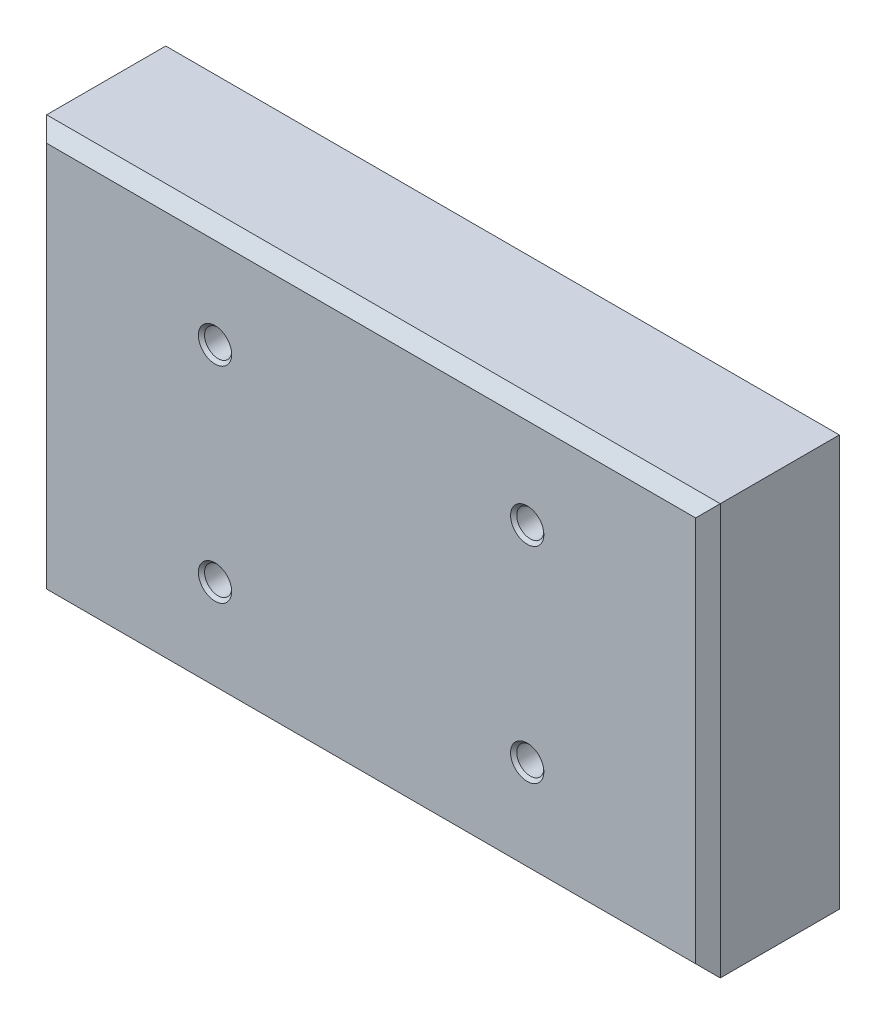
ISO-10303-21;
HEADER;
FILE_DESCRIPTION(('STEP AP214'),'2;1');
FILE_NAME('part.step','',(''),(''),'','','');
FILE_SCHEMA(('AUTOMOTIVE_DESIGN { 1 0 10303 214 1 1 1 1 }'));
ENDSEC;
DATA;
#1=APPLICATION_CONTEXT('core data for automotive mechanical design processes');
#2=APPLICATION_PROTOCOL_DEFINITION('international standard','automotive_design',2000,#1);
#3=PRODUCT_CONTEXT('',#1,'mechanical');
#4=PRODUCT('Part','Part','',(#3));
#5=PRODUCT_RELATED_PRODUCT_CATEGORY('part','',(#4));
#6=PRODUCT_DEFINITION_FORMATION('','',#4);
#7=PRODUCT_DEFINITION_CONTEXT('part definition',#1,'design');
#8=PRODUCT_DEFINITION('design','',#6,#7);
#9=PRODUCT_DEFINITION_SHAPE('','',#8);
#10=(LENGTH_UNIT() NAMED_UNIT(*) SI_UNIT(.MILLI.,.METRE.));
#11=(NAMED_UNIT(*) PLANE_ANGLE_UNIT() SI_UNIT($,.RADIAN.));
#12=(NAMED_UNIT(*) SI_UNIT($,.STERADIAN.) SOLID_ANGLE_UNIT());
#13=UNCERTAINTY_MEASURE_WITH_UNIT(LENGTH_MEASURE(1.E-05),#10,'distance_accuracy_value','');
#14=(GEOMETRIC_REPRESENTATION_CONTEXT(3) GLOBAL_UNCERTAINTY_ASSIGNED_CONTEXT((#13)) GLOBAL_UNIT_ASSIGNED_CONTEXT((#10,
#11,#12)) REPRESENTATION_CONTEXT('',''));
#15=CARTESIAN_POINT('',(0.,0.,0.));
#16=DIRECTION('',(0.,0.,1.));
#17=DIRECTION('',(1.,0.,0.));
#18=AXIS2_PLACEMENT_3D('',#15,#16,#17);
#19=CARTESIAN_POINT('',(20.5,-12.5,20.0254530007024));
#20=DIRECTION('',(-1.,0.,0.));
#21=DIRECTION('',(0.,-1.,0.));
#22=AXIS2_PLACEMENT_3D('',#19,#20,#21);
#23=PLANE('',#22);
#24=DIRECTION('',(0.,0.,-1.));
#25=VECTOR('',#24,1.);
#26=CARTESIAN_POINT('',(20.5,62.5,20.0254530007024));
#27=LINE('',#26,#25);
#28=CARTESIAN_POINT('',(20.5,62.5,17.7754530007024));
#29=VERTEX_POINT('',#28);
#30=CARTESIAN_POINT('',(20.5,62.5,-3.97454699929757));
#31=VERTEX_POINT('',#30);
#32=EDGE_CURVE('E169',#29,#31,#27,.T.);
#33=ORIENTED_EDGE('',*,*,#32,.F.);
#34=DIRECTION('',(0.,-1.,0.));
#35=VECTOR('',#34,1.);
#36=CARTESIAN_POINT('',(20.5,-12.5,17.7754530007024));
#37=LINE('',#36,#35);
#38=CARTESIAN_POINT('',(20.5,-12.5,17.7754530007024));
#39=VERTEX_POINT('',#38);
#40=EDGE_CURVE('E67',#29,#39,#37,.T.);
#41=ORIENTED_EDGE('',*,*,#40,.T.);
#42=DIRECTION('',(0.,0.,-1.));
#43=VECTOR('',#42,1.);
#44=CARTESIAN_POINT('',(20.5,-12.5,20.0254530007024));
#45=LINE('',#44,#43);
#46=CARTESIAN_POINT('',(20.5,-12.5,-3.97454699929757));
#47=VERTEX_POINT('',#46);
#48=EDGE_CURVE('E163',#39,#47,#45,.T.);
#49=ORIENTED_EDGE('',*,*,#48,.T.);
#50=DIRECTION('',(0.,1.,0.));
#51=VECTOR('',#50,1.);
#52=CARTESIAN_POINT('',(20.5,-12.5,-3.97454699929757));
#53=LINE('',#52,#51);
#54=EDGE_CURVE('E151',#47,#31,#53,.T.);
#55=ORIENTED_EDGE('',*,*,#54,.T.);
#56=EDGE_LOOP('',(#33,#41,#49,#55));
#57=FACE_BOUND('',#56,.T.);
#58=ADVANCED_FACE('F43',(#57),#23,.F.);
#59=CARTESIAN_POINT('',(20.5,62.5,20.0254530007024));
#60=DIRECTION('',(0.,-1.,0.));
#61=DIRECTION('',(1.,0.,0.));
#62=AXIS2_PLACEMENT_3D('',#59,#60,#61);
#63=PLANE('',#62);
#64=DIRECTION('',(0.,0.,-1.));
#65=VECTOR('',#64,1.);
#66=CARTESIAN_POINT('',(-102.5,62.5,20.0254530007024));
#67=LINE('',#66,#65);
#68=CARTESIAN_POINT('',(-102.5,62.5,17.7754530007024));
#69=VERTEX_POINT('',#68);
#70=CARTESIAN_POINT('',(-102.5,62.5,-3.97454699929757));
#71=VERTEX_POINT('',#70);
#72=EDGE_CURVE('E167',#69,#71,#67,.T.);
#73=ORIENTED_EDGE('',*,*,#72,.F.);
#74=DIRECTION('',(1.,0.,0.));
#75=VECTOR('',#74,1.);
#76=CARTESIAN_POINT('',(20.5,62.5,17.7754530007024));
#77=LINE('',#76,#75);
#78=EDGE_CURVE('E180',#69,#29,#77,.T.);
#79=ORIENTED_EDGE('',*,*,#78,.T.);
#80=ORIENTED_EDGE('',*,*,#32,.T.);
#81=DIRECTION('',(-1.,0.,0.));
#82=VECTOR('',#81,1.);
#83=CARTESIAN_POINT('',(20.5,62.5,-3.97454699929757));
#84=LINE('',#83,#82);
#85=EDGE_CURVE('E154',#31,#71,#84,.T.);
#86=ORIENTED_EDGE('',*,*,#85,.T.);
#87=EDGE_LOOP('',(#73,#79,#80,#86));
#88=FACE_BOUND('',#87,.T.);
#89=ADVANCED_FACE('F234',(#88),#63,.F.);
#90=CARTESIAN_POINT('',(-102.5,-12.5,20.0254530007024));
#91=DIRECTION('',(1.,0.,0.));
#92=DIRECTION('',(0.,0.,-1.));
#93=AXIS2_PLACEMENT_3D('',#90,#91,#92);
#94=PLANE('',#93);
#95=DIRECTION('',(0.,0.,-1.));
#96=VECTOR('',#95,1.);
#97=CARTESIAN_POINT('',(-102.5,-12.5,20.0254530007024));
#98=LINE('',#97,#96);
#99=CARTESIAN_POINT('',(-102.5,-12.5,17.7754530007024));
#100=VERTEX_POINT('',#99);
#101=CARTESIAN_POINT('',(-102.5,-12.5,-3.97454699929757));
#102=VERTEX_POINT('',#101);
#103=EDGE_CURVE('E165',#100,#102,#98,.T.);
#104=ORIENTED_EDGE('',*,*,#103,.F.);
#105=DIRECTION('',(0.,1.,0.));
#106=VECTOR('',#105,1.);
#107=CARTESIAN_POINT('',(-102.5,62.5,17.7754530007024));
#108=LINE('',#107,#106);
#109=EDGE_CURVE('E11',#100,#69,#108,.T.);
#110=ORIENTED_EDGE('',*,*,#109,.T.);
#111=ORIENTED_EDGE('',*,*,#72,.T.);
#112=DIRECTION('',(0.,-1.,0.));
#113=VECTOR('',#112,1.);
#114=CARTESIAN_POINT('',(-102.5,-12.5,-3.97454699929757));
#115=LINE('',#114,#113);
#116=EDGE_CURVE('E157',#71,#102,#115,.T.);
#117=ORIENTED_EDGE('',*,*,#116,.T.);
#118=EDGE_LOOP('',(#104,#110,#111,#117));
#119=FACE_BOUND('',#118,.T.);
#120=ADVANCED_FACE('F239',(#119),#94,.F.);
#121=CARTESIAN_POINT('',(20.5,-12.5,20.0254530007024));
#122=DIRECTION('',(0.,1.,0.));
#123=DIRECTION('',(-1.,0.,0.));
#124=AXIS2_PLACEMENT_3D('',#121,#122,#123);
#125=PLANE('',#124);
#126=ORIENTED_EDGE('',*,*,#48,.F.);
#127=DIRECTION('',(-1.,0.,0.));
#128=VECTOR('',#127,1.);
#129=CARTESIAN_POINT('',(-102.5,-12.5,17.7754530007024));
#130=LINE('',#129,#128);
#131=EDGE_CURVE('E52',#39,#100,#130,.T.);
#132=ORIENTED_EDGE('',*,*,#131,.T.);
#133=ORIENTED_EDGE('',*,*,#103,.T.);
#134=DIRECTION('',(1.,0.,0.));
#135=VECTOR('',#134,1.);
#136=CARTESIAN_POINT('',(20.5,-12.5,-3.97454699929757));
#137=LINE('',#136,#135);
#138=EDGE_CURVE('E160',#102,#47,#137,.T.);
#139=ORIENTED_EDGE('',*,*,#138,.T.);
#140=EDGE_LOOP('',(#126,#132,#133,#139));
#141=FACE_BOUND('',#140,.T.);
#142=ADVANCED_FACE('F207',(#141),#125,.F.);
#143=CARTESIAN_POINT('',(20.5,-12.5,20.0254530007024));
#144=DIRECTION('',(0.,0.,1.));
#145=DIRECTION('',(1.,0.,0.));
#146=AXIS2_PLACEMENT_3D('',#143,#144,#145);
#147=PLANE('',#146);
#148=DIRECTION('',(0.,1.,0.));
#149=VECTOR('',#148,1.);
#150=CARTESIAN_POINT('',(18.25,62.5,20.0254530007024));
#151=LINE('',#150,#149);
#152=CARTESIAN_POINT('',(18.25,-10.25,20.0254530007024));
#153=VERTEX_POINT('',#152);
#154=CARTESIAN_POINT('',(18.25,60.25,20.0254530007024));
#155=VERTEX_POINT('',#154);
#156=EDGE_CURVE('E175',#153,#155,#151,.T.);
#157=ORIENTED_EDGE('',*,*,#156,.T.);
#158=DIRECTION('',(-1.,0.,0.));
#159=VECTOR('',#158,1.);
#160=CARTESIAN_POINT('',(-102.5,60.25,20.0254530007024));
#161=LINE('',#160,#159);
#162=CARTESIAN_POINT('',(-100.25,60.25,20.0254530007024));
#163=VERTEX_POINT('',#162);
#164=EDGE_CURVE('E177',#155,#163,#161,.T.);
#165=ORIENTED_EDGE('',*,*,#164,.T.);
#166=DIRECTION('',(0.,-1.,0.));
#167=VECTOR('',#166,1.);
#168=CARTESIAN_POINT('',(-100.25,-12.5,20.0254530007024));
#169=LINE('',#168,#167);
#170=CARTESIAN_POINT('',(-100.25,-10.25,20.0254530007024));
#171=VERTEX_POINT('',#170);
#172=EDGE_CURVE('E171',#163,#171,#169,.T.);
#173=ORIENTED_EDGE('',*,*,#172,.T.);
#174=DIRECTION('',(1.,0.,0.));
#175=VECTOR('',#174,1.);
#176=CARTESIAN_POINT('',(20.5,-10.25,20.0254530007024));
#177=LINE('',#176,#175);
#178=EDGE_CURVE('E173',#171,#153,#177,.T.);
#179=ORIENTED_EDGE('',*,*,#178,.T.);
#180=EDGE_LOOP('',(#157,#165,#173,#179));
#181=FACE_BOUND('',#180,.T.);
#182=CARTESIAN_POINT('',(-69.5,43.75,20.0254530007024));
#183=DIRECTION('',(0.,0.,1.));
#184=DIRECTION('',(1.,0.,0.));
#185=AXIS2_PLACEMENT_3D('',#182,#183,#184);
#186=CIRCLE('',#185,3.0375);
#187=CARTESIAN_POINT('',(-66.4625,43.75,20.0254530007024));
#188=VERTEX_POINT('',#187);
#189=EDGE_CURVE('E124',#188,#188,#186,.T.);
#190=ORIENTED_EDGE('',*,*,#189,.F.);
#191=EDGE_LOOP('',(#190));
#192=FACE_BOUND('',#191,.T.);
#193=CARTESIAN_POINT('',(-69.5,6.25,20.0254530007024));
#194=DIRECTION('',(0.,0.,1.));
#195=DIRECTION('',(1.,0.,0.));
#196=AXIS2_PLACEMENT_3D('',#193,#194,#195);
#197=CIRCLE('',#196,3.0375);
#198=CARTESIAN_POINT('',(-66.4625,6.25,20.0254530007024));
#199=VERTEX_POINT('',#198);
#200=EDGE_CURVE('E117',#199,#199,#197,.T.);
#201=ORIENTED_EDGE('',*,*,#200,.F.);
#202=EDGE_LOOP('',(#201));
#203=FACE_BOUND('',#202,.T.);
#204=CARTESIAN_POINT('',(-12.5,6.25000000000001,20.0254530007024));
#205=DIRECTION('',(0.,0.,1.));
#206=DIRECTION('',(1.,0.,0.));
#207=AXIS2_PLACEMENT_3D('',#204,#205,#206);
#208=CIRCLE('',#207,3.0375);
#209=CARTESIAN_POINT('',(-9.46249999999999,6.25000000000001,20.0254530007024));
#210=VERTEX_POINT('',#209);
#211=EDGE_CURVE('E133',#210,#210,#208,.T.);
#212=ORIENTED_EDGE('',*,*,#211,.F.);
#213=EDGE_LOOP('',(#212));
#214=FACE_BOUND('',#213,.T.);
#215=CARTESIAN_POINT('',(-12.5,43.75,20.0254530007024));
#216=DIRECTION('',(0.,0.,1.));
#217=DIRECTION('',(1.,0.,0.));
#218=AXIS2_PLACEMENT_3D('',#215,#216,#217);
#219=CIRCLE('',#218,3.0375);
#220=CARTESIAN_POINT('',(-9.4625,43.75,20.0254530007024));
#221=VERTEX_POINT('',#220);
#222=EDGE_CURVE('E142',#221,#221,#219,.T.);
#223=ORIENTED_EDGE('',*,*,#222,.F.);
#224=EDGE_LOOP('',(#223));
#225=FACE_BOUND('',#224,.T.);
#226=ADVANCED_FACE('F203',(#181,#192,#203,#214,#225),#147,.T.);
#227=CARTESIAN_POINT('',(20.5,-12.5,-3.97454699929757));
#228=DIRECTION('',(0.,0.,1.));
#229=DIRECTION('',(1.,0.,0.));
#230=AXIS2_PLACEMENT_3D('',#227,#228,#229);
#231=PLANE('',#230);
#232=ORIENTED_EDGE('',*,*,#54,.F.);
#233=ORIENTED_EDGE('',*,*,#138,.F.);
#234=ORIENTED_EDGE('',*,*,#116,.F.);
#235=ORIENTED_EDGE('',*,*,#85,.F.);
#236=EDGE_LOOP('',(#232,#233,#234,#235));
#237=FACE_BOUND('',#236,.T.);
#238=ADVANCED_FACE('F206',(#237),#231,.F.);
#239=CARTESIAN_POINT('',(-12.5,43.75,8.02545300070243));
#240=DIRECTION('',(0.,0.,1.));
#241=DIRECTION('',(1.,0.,0.));
#242=AXIS2_PLACEMENT_3D('',#239,#240,#241);
#243=CONICAL_SURFACE('',#242,2.475,1.02974425867665);
#244=CARTESIAN_POINT('',(-12.5,43.75,6.53832296860922));
#245=VERTEX_POINT('',#244);
#246=VERTEX_LOOP('',#245);
#247=FACE_BOUND('',#246,.T.);
#248=CARTESIAN_POINT('',(-12.5,43.75,8.02545300070243));
#249=DIRECTION('',(0.,0.,1.));
#250=DIRECTION('',(1.,0.,0.));
#251=AXIS2_PLACEMENT_3D('',#248,#249,#250);
#252=CIRCLE('',#251,2.475);
#253=CARTESIAN_POINT('',(-10.025,43.75,8.02545300070243));
#254=VERTEX_POINT('',#253);
#255=EDGE_CURVE('E148',#254,#254,#252,.T.);
#256=ORIENTED_EDGE('',*,*,#255,.T.);
#257=EDGE_LOOP('',(#256));
#258=FACE_BOUND('',#257,.T.);
#259=ADVANCED_FACE('F229',(#247,#258),#243,.F.);
#260=CARTESIAN_POINT('',(-12.5,43.75,20.0254530007024));
#261=DIRECTION('',(0.,0.,1.));
#262=DIRECTION('',(1.,0.,0.));
#263=AXIS2_PLACEMENT_3D('',#260,#261,#262);
#264=CYLINDRICAL_SURFACE('',#263,2.475);
#265=ORIENTED_EDGE('',*,*,#255,.F.);
#266=EDGE_LOOP('',(#265));
#267=FACE_BOUND('',#266,.T.);
#268=CARTESIAN_POINT('',(-12.5,43.75,19.4629530007024));
#269=DIRECTION('',(0.,0.,1.));
#270=DIRECTION('',(1.,0.,0.));
#271=AXIS2_PLACEMENT_3D('',#268,#269,#270);
#272=CIRCLE('',#271,2.475);
#273=CARTESIAN_POINT('',(-10.025,43.75,19.4629530007024));
#274=VERTEX_POINT('',#273);
#275=EDGE_CURVE('E145',#274,#274,#272,.T.);
#276=ORIENTED_EDGE('',*,*,#275,.T.);
#277=EDGE_LOOP('',(#276));
#278=FACE_BOUND('',#277,.T.);
#279=ADVANCED_FACE('F219',(#267,#278),#264,.F.);
#280=CARTESIAN_POINT('',(-12.5,43.75,20.0254530007024));
#281=DIRECTION('',(0.,0.,1.));
#282=DIRECTION('',(1.,0.,0.));
#283=AXIS2_PLACEMENT_3D('',#280,#281,#282);
#284=CONICAL_SURFACE('',#283,3.0375,0.785398163397444);
#285=ORIENTED_EDGE('',*,*,#275,.F.);
#286=EDGE_LOOP('',(#285));
#287=FACE_BOUND('',#286,.T.);
#288=ORIENTED_EDGE('',*,*,#222,.T.);
#289=EDGE_LOOP('',(#288));
#290=FACE_BOUND('',#289,.T.);
#291=ADVANCED_FACE('F216',(#287,#290),#284,.F.);
#292=CARTESIAN_POINT('',(-12.5,6.25000000000001,8.02545300070243));
#293=DIRECTION('',(0.,0.,1.));
#294=DIRECTION('',(1.,0.,0.));
#295=AXIS2_PLACEMENT_3D('',#292,#293,#294);
#296=CONICAL_SURFACE('',#295,2.475,1.02974425867665);
#297=CARTESIAN_POINT('',(-12.5,6.25000000000001,6.53832296860922));
#298=VERTEX_POINT('',#297);
#299=VERTEX_LOOP('',#298);
#300=FACE_BOUND('',#299,.T.);
#301=CARTESIAN_POINT('',(-12.5,6.25000000000001,8.02545300070243));
#302=DIRECTION('',(0.,0.,1.));
#303=DIRECTION('',(1.,0.,0.));
#304=AXIS2_PLACEMENT_3D('',#301,#302,#303);
#305=CIRCLE('',#304,2.475);
#306=CARTESIAN_POINT('',(-10.025,6.25000000000001,8.02545300070243));
#307=VERTEX_POINT('',#306);
#308=EDGE_CURVE('E139',#307,#307,#305,.T.);
#309=ORIENTED_EDGE('',*,*,#308,.T.);
#310=EDGE_LOOP('',(#309));
#311=FACE_BOUND('',#310,.T.);
#312=ADVANCED_FACE('F218',(#300,#311),#296,.F.);
#313=CARTESIAN_POINT('',(-12.5,6.25000000000001,20.0254530007024));
#314=DIRECTION('',(0.,0.,1.));
#315=DIRECTION('',(1.,0.,0.));
#316=AXIS2_PLACEMENT_3D('',#313,#314,#315);
#317=CYLINDRICAL_SURFACE('',#316,2.475);
#318=ORIENTED_EDGE('',*,*,#308,.F.);
#319=EDGE_LOOP('',(#318));
#320=FACE_BOUND('',#319,.T.);
#321=CARTESIAN_POINT('',(-12.5,6.25000000000001,19.4629530007024));
#322=DIRECTION('',(0.,0.,1.));
#323=DIRECTION('',(1.,0.,0.));
#324=AXIS2_PLACEMENT_3D('',#321,#322,#323);
#325=CIRCLE('',#324,2.475);
#326=CARTESIAN_POINT('',(-10.025,6.25000000000001,19.4629530007024));
#327=VERTEX_POINT('',#326);
#328=EDGE_CURVE('E136',#327,#327,#325,.T.);
#329=ORIENTED_EDGE('',*,*,#328,.T.);
#330=EDGE_LOOP('',(#329));
#331=FACE_BOUND('',#330,.T.);
#332=ADVANCED_FACE('F226',(#320,#331),#317,.F.);
#333=CARTESIAN_POINT('',(-12.5,6.25000000000001,20.0254530007024));
#334=DIRECTION('',(0.,0.,1.));
#335=DIRECTION('',(1.,0.,0.));
#336=AXIS2_PLACEMENT_3D('',#333,#334,#335);
#337=CONICAL_SURFACE('',#336,3.0375,0.785398163397444);
#338=ORIENTED_EDGE('',*,*,#328,.F.);
#339=EDGE_LOOP('',(#338));
#340=FACE_BOUND('',#339,.T.);
#341=ORIENTED_EDGE('',*,*,#211,.T.);
#342=EDGE_LOOP('',(#341));
#343=FACE_BOUND('',#342,.T.);
#344=ADVANCED_FACE('F303',(#340,#343),#337,.F.);
#345=CARTESIAN_POINT('',(-69.5,6.25,8.02545300070243));
#346=DIRECTION('',(0.,0.,1.));
#347=DIRECTION('',(1.,0.,0.));
#348=AXIS2_PLACEMENT_3D('',#345,#346,#347);
#349=CONICAL_SURFACE('',#348,2.475,1.02974425867665);
#350=CARTESIAN_POINT('',(-69.5,6.25,6.53832296860922));
#351=VERTEX_POINT('',#350);
#352=VERTEX_LOOP('',#351);
#353=FACE_BOUND('',#352,.T.);
#354=CARTESIAN_POINT('',(-69.5,6.25,8.02545300070243));
#355=DIRECTION('',(0.,0.,1.));
#356=DIRECTION('',(1.,0.,0.));
#357=AXIS2_PLACEMENT_3D('',#354,#355,#356);
#358=CIRCLE('',#357,2.475);
#359=CARTESIAN_POINT('',(-67.025,6.25,8.02545300070243));
#360=VERTEX_POINT('',#359);
#361=EDGE_CURVE('E130',#360,#360,#358,.T.);
#362=ORIENTED_EDGE('',*,*,#361,.T.);
#363=EDGE_LOOP('',(#362));
#364=FACE_BOUND('',#363,.T.);
#365=ADVANCED_FACE('F317',(#353,#364),#349,.F.);
#366=CARTESIAN_POINT('',(-69.5,6.25,20.0254530007024));
#367=DIRECTION('',(0.,0.,1.));
#368=DIRECTION('',(1.,0.,0.));
#369=AXIS2_PLACEMENT_3D('',#366,#367,#368);
#370=CYLINDRICAL_SURFACE('',#369,2.475);
#371=ORIENTED_EDGE('',*,*,#361,.F.);
#372=EDGE_LOOP('',(#371));
#373=FACE_BOUND('',#372,.T.);
#374=CARTESIAN_POINT('',(-69.5,6.25,19.4629530007024));
#375=DIRECTION('',(0.,0.,1.));
#376=DIRECTION('',(1.,0.,0.));
#377=AXIS2_PLACEMENT_3D('',#374,#375,#376);
#378=CIRCLE('',#377,2.475);
#379=CARTESIAN_POINT('',(-67.025,6.25,19.4629530007024));
#380=VERTEX_POINT('',#379);
#381=EDGE_CURVE('E121',#380,#380,#378,.T.);
#382=ORIENTED_EDGE('',*,*,#381,.T.);
#383=EDGE_LOOP('',(#382));
#384=FACE_BOUND('',#383,.T.);
#385=ADVANCED_FACE('F312',(#373,#384),#370,.F.);
#386=CARTESIAN_POINT('',(-69.5,6.25,20.0254530007024));
#387=DIRECTION('',(0.,0.,1.));
#388=DIRECTION('',(1.,0.,0.));
#389=AXIS2_PLACEMENT_3D('',#386,#387,#388);
#390=CONICAL_SURFACE('',#389,3.0375,0.785398163397444);
#391=ORIENTED_EDGE('',*,*,#381,.F.);
#392=EDGE_LOOP('',(#391));
#393=FACE_BOUND('',#392,.T.);
#394=ORIENTED_EDGE('',*,*,#200,.T.);
#395=EDGE_LOOP('',(#394));
#396=FACE_BOUND('',#395,.T.);
#397=ADVANCED_FACE('F111',(#393,#396),#390,.F.);
#398=CARTESIAN_POINT('',(-69.5,43.75,8.02545300070243));
#399=DIRECTION('',(0.,0.,1.));
#400=DIRECTION('',(1.,0.,0.));
#401=AXIS2_PLACEMENT_3D('',#398,#399,#400);
#402=CONICAL_SURFACE('',#401,2.475,1.02974425867665);
#403=CARTESIAN_POINT('',(-69.5,43.75,6.53832296860922));
#404=VERTEX_POINT('',#403);
#405=VERTEX_LOOP('',#404);
#406=FACE_BOUND('',#405,.T.);
#407=CARTESIAN_POINT('',(-69.5,43.75,8.02545300070243));
#408=DIRECTION('',(0.,0.,1.));
#409=DIRECTION('',(1.,0.,0.));
#410=AXIS2_PLACEMENT_3D('',#407,#408,#409);
#411=CIRCLE('',#410,2.475);
#412=CARTESIAN_POINT('',(-67.025,43.75,8.02545300070243));
#413=VERTEX_POINT('',#412);
#414=EDGE_CURVE('E115',#413,#413,#411,.T.);
#415=ORIENTED_EDGE('',*,*,#414,.T.);
#416=EDGE_LOOP('',(#415));
#417=FACE_BOUND('',#416,.T.);
#418=ADVANCED_FACE('F107',(#406,#417),#402,.F.);
#419=CARTESIAN_POINT('',(-69.5,43.75,20.0254530007024));
#420=DIRECTION('',(0.,0.,1.));
#421=DIRECTION('',(1.,0.,0.));
#422=AXIS2_PLACEMENT_3D('',#419,#420,#421);
#423=CYLINDRICAL_SURFACE('',#422,2.475);
#424=ORIENTED_EDGE('',*,*,#414,.F.);
#425=EDGE_LOOP('',(#424));
#426=FACE_BOUND('',#425,.T.);
#427=CARTESIAN_POINT('',(-69.5,43.75,19.4629530007024));
#428=DIRECTION('',(0.,0.,1.));
#429=DIRECTION('',(1.,0.,0.));
#430=AXIS2_PLACEMENT_3D('',#427,#428,#429);
#431=CIRCLE('',#430,2.475);
#432=CARTESIAN_POINT('',(-67.025,43.75,19.4629530007024));
#433=VERTEX_POINT('',#432);
#434=EDGE_CURVE('E118',#433,#433,#431,.T.);
#435=ORIENTED_EDGE('',*,*,#434,.T.);
#436=EDGE_LOOP('',(#435));
#437=FACE_BOUND('',#436,.T.);
#438=ADVANCED_FACE('F110',(#426,#437),#423,.F.);
#439=CARTESIAN_POINT('',(-69.5,43.75,20.0254530007024));
#440=DIRECTION('',(0.,0.,1.));
#441=DIRECTION('',(1.,0.,0.));
#442=AXIS2_PLACEMENT_3D('',#439,#440,#441);
#443=CONICAL_SURFACE('',#442,3.0375,0.785398163397444);
#444=ORIENTED_EDGE('',*,*,#434,.F.);
#445=EDGE_LOOP('',(#444));
#446=FACE_BOUND('',#445,.T.);
#447=ORIENTED_EDGE('',*,*,#189,.T.);
#448=EDGE_LOOP('',(#447));
#449=FACE_BOUND('',#448,.T.);
#450=ADVANCED_FACE('F201',(#446,#449),#443,.F.);
#451=CARTESIAN_POINT('',(20.5,-10.25,20.0254530007024));
#452=DIRECTION('',(0.,-0.707106781186544,0.707106781186551));
#453=DIRECTION('',(-1.,0.,0.));
#454=AXIS2_PLACEMENT_3D('',#451,#452,#453);
#455=PLANE('',#454);
#456=DIRECTION('',(0.577350269189628,0.577350269189628,0.577350269189622));
#457=VECTOR('',#456,1.);
#458=CARTESIAN_POINT('',(-101.,-11.,19.2754530007024));
#459=LINE('',#458,#457);
#460=EDGE_CURVE('E188',#100,#171,#459,.T.);
#461=ORIENTED_EDGE('',*,*,#460,.F.);
#462=ORIENTED_EDGE('',*,*,#131,.F.);
#463=DIRECTION('',(-0.577350269189628,0.577350269189628,0.577350269189622));
#464=VECTOR('',#463,1.);
#465=CARTESIAN_POINT('',(19.,-11.,19.2754530007024));
#466=LINE('',#465,#464);
#467=EDGE_CURVE('E47',#153,#39,#466,.F.);
#468=ORIENTED_EDGE('',*,*,#467,.F.);
#469=ORIENTED_EDGE('',*,*,#178,.F.);
#470=EDGE_LOOP('',(#461,#462,#468,#469));
#471=FACE_BOUND('',#470,.T.);
#472=ADVANCED_FACE('F45',(#471),#455,.T.);
#473=CARTESIAN_POINT('',(18.25,-12.5,20.0254530007024));
#474=DIRECTION('',(0.707106781186544,0.,0.707106781186551));
#475=DIRECTION('',(0.,-1.,0.));
#476=AXIS2_PLACEMENT_3D('',#473,#474,#475);
#477=PLANE('',#476);
#478=ORIENTED_EDGE('',*,*,#467,.T.);
#479=ORIENTED_EDGE('',*,*,#40,.F.);
#480=DIRECTION('',(-0.577350269189628,-0.577350269189628,0.577350269189622));
#481=VECTOR('',#480,1.);
#482=CARTESIAN_POINT('',(-6.00000000000019,35.9999999999998,44.2754530007024));
#483=LINE('',#482,#481);
#484=EDGE_CURVE('E187',#155,#29,#483,.F.);
#485=ORIENTED_EDGE('',*,*,#484,.F.);
#486=ORIENTED_EDGE('',*,*,#156,.F.);
#487=EDGE_LOOP('',(#478,#479,#485,#486));
#488=FACE_BOUND('',#487,.T.);
#489=ADVANCED_FACE('F250',(#488),#477,.T.);
#490=CARTESIAN_POINT('',(-100.25,-12.5,20.0254530007024));
#491=DIRECTION('',(-0.707106781186544,0.,0.707106781186551));
#492=DIRECTION('',(0.,1.,0.));
#493=AXIS2_PLACEMENT_3D('',#490,#491,#492);
#494=PLANE('',#493);
#495=ORIENTED_EDGE('',*,*,#460,.T.);
#496=ORIENTED_EDGE('',*,*,#172,.F.);
#497=DIRECTION('',(-0.577350269189628,0.577350269189628,-0.577350269189622));
#498=VECTOR('',#497,1.);
#499=CARTESIAN_POINT('',(-75.9999999999998,35.9999999999998,44.2754530007023));
#500=LINE('',#499,#498);
#501=EDGE_CURVE('E185',#69,#163,#500,.F.);
#502=ORIENTED_EDGE('',*,*,#501,.F.);
#503=ORIENTED_EDGE('',*,*,#109,.F.);
#504=EDGE_LOOP('',(#495,#496,#502,#503));
#505=FACE_BOUND('',#504,.T.);
#506=ADVANCED_FACE('F247',(#505),#494,.T.);
#507=CARTESIAN_POINT('',(20.5,60.25,20.0254530007024));
#508=DIRECTION('',(0.,0.707106781186544,0.707106781186551));
#509=DIRECTION('',(1.,0.,0.));
#510=AXIS2_PLACEMENT_3D('',#507,#508,#509);
#511=PLANE('',#510);
#512=ORIENTED_EDGE('',*,*,#484,.T.);
#513=ORIENTED_EDGE('',*,*,#78,.F.);
#514=ORIENTED_EDGE('',*,*,#501,.T.);
#515=ORIENTED_EDGE('',*,*,#164,.F.);
#516=EDGE_LOOP('',(#512,#513,#514,#515));
#517=FACE_BOUND('',#516,.T.);
#518=ADVANCED_FACE('F244',(#517),#511,.T.);
#519=CLOSED_SHELL('',(#58,#89,#120,#142,#226,#238,#259,#279,#291,#312,#332,#344,#365,#385,#397,
#418,#438,#450,#472,#489,#506,#518));
#520=MANIFOLD_SOLID_BREP('B2',#519);
#521=ADVANCED_BREP_SHAPE_REPRESENTATION('',(#18,#520),#14);
#522=SHAPE_DEFINITION_REPRESENTATION(#9,#521);
ENDSEC;
END-ISO-10303-21;
